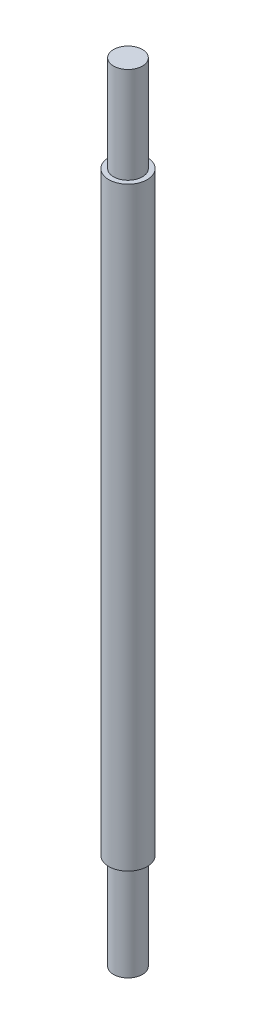
ISO-10303-21;
HEADER;
FILE_DESCRIPTION(('STEP AP214'),'2;1');
FILE_NAME('part.step','',(''),(''),'','','');
FILE_SCHEMA(('AUTOMOTIVE_DESIGN { 1 0 10303 214 1 1 1 1 }'));
ENDSEC;
DATA;
#1=APPLICATION_CONTEXT('core data for automotive mechanical design processes');
#2=APPLICATION_PROTOCOL_DEFINITION('international standard','automotive_design',2000,#1);
#3=PRODUCT_CONTEXT('',#1,'mechanical');
#4=PRODUCT('Part','Part','',(#3));
#5=PRODUCT_RELATED_PRODUCT_CATEGORY('part','',(#4));
#6=PRODUCT_DEFINITION_FORMATION('','',#4);
#7=PRODUCT_DEFINITION_CONTEXT('part definition',#1,'design');
#8=PRODUCT_DEFINITION('design','',#6,#7);
#9=PRODUCT_DEFINITION_SHAPE('','',#8);
#10=(LENGTH_UNIT() NAMED_UNIT(*) SI_UNIT(.MILLI.,.METRE.));
#11=(NAMED_UNIT(*) PLANE_ANGLE_UNIT() SI_UNIT($,.RADIAN.));
#12=(NAMED_UNIT(*) SI_UNIT($,.STERADIAN.) SOLID_ANGLE_UNIT());
#13=UNCERTAINTY_MEASURE_WITH_UNIT(LENGTH_MEASURE(1.E-05),#10,'distance_accuracy_value','');
#14=(GEOMETRIC_REPRESENTATION_CONTEXT(3) GLOBAL_UNCERTAINTY_ASSIGNED_CONTEXT((#13)) GLOBAL_UNIT_ASSIGNED_CONTEXT((#10,
#11,#12)) REPRESENTATION_CONTEXT('',''));
#15=CARTESIAN_POINT('',(0.,0.,0.));
#16=DIRECTION('',(0.,0.,1.));
#17=DIRECTION('',(1.,0.,0.));
#18=AXIS2_PLACEMENT_3D('',#15,#16,#17);
#19=CARTESIAN_POINT('',(0.,0.,0.));
#20=DIRECTION('',(0.,1.,0.));
#21=DIRECTION('',(0.,0.,1.));
#22=AXIS2_PLACEMENT_3D('',#19,#20,#21);
#23=PLANE('',#22);
#24=CARTESIAN_POINT('',(0.,0.,0.));
#25=DIRECTION('',(0.,1.,0.));
#26=DIRECTION('',(0.,0.,1.));
#27=AXIS2_PLACEMENT_3D('',#24,#25,#26);
#28=CIRCLE('',#27,2.);
#29=CARTESIAN_POINT('',(0.,0.,2.));
#30=VERTEX_POINT('',#29);
#31=EDGE_CURVE('E41',#30,#30,#28,.T.);
#32=ORIENTED_EDGE('',*,*,#31,.F.);
#33=EDGE_LOOP('',(#32));
#34=FACE_BOUND('',#33,.T.);
#35=CARTESIAN_POINT('',(0.,0.,0.));
#36=DIRECTION('',(0.,1.,0.));
#37=DIRECTION('',(0.,0.,1.));
#38=AXIS2_PLACEMENT_3D('',#35,#36,#37);
#39=CIRCLE('',#38,1.5);
#40=CARTESIAN_POINT('',(0.,0.,1.5));
#41=VERTEX_POINT('',#40);
#42=EDGE_CURVE('E10',#41,#41,#39,.F.);
#43=ORIENTED_EDGE('',*,*,#42,.F.);
#44=EDGE_LOOP('',(#43));
#45=FACE_BOUND('',#44,.T.);
#46=ADVANCED_FACE('F30',(#34,#45),#23,.F.);
#47=CARTESIAN_POINT('',(0.,62.,0.));
#48=DIRECTION('',(0.,1.,0.));
#49=DIRECTION('',(0.,0.,1.));
#50=AXIS2_PLACEMENT_3D('',#47,#48,#49);
#51=PLANE('',#50);
#52=CARTESIAN_POINT('',(0.,62.,0.));
#53=DIRECTION('',(0.,1.,0.));
#54=DIRECTION('',(0.,0.,1.));
#55=AXIS2_PLACEMENT_3D('',#52,#53,#54);
#56=CIRCLE('',#55,2.);
#57=CARTESIAN_POINT('',(0.,62.,2.));
#58=VERTEX_POINT('',#57);
#59=EDGE_CURVE('E37',#58,#58,#56,.T.);
#60=ORIENTED_EDGE('',*,*,#59,.T.);
#61=EDGE_LOOP('',(#60));
#62=FACE_BOUND('',#61,.T.);
#63=CARTESIAN_POINT('',(0.,62.,0.));
#64=DIRECTION('',(0.,1.,0.));
#65=DIRECTION('',(0.,0.,1.));
#66=AXIS2_PLACEMENT_3D('',#63,#64,#65);
#67=CIRCLE('',#66,1.5);
#68=CARTESIAN_POINT('',(0.,62.,1.5));
#69=VERTEX_POINT('',#68);
#70=EDGE_CURVE('E48',#69,#69,#67,.T.);
#71=ORIENTED_EDGE('',*,*,#70,.F.);
#72=EDGE_LOOP('',(#71));
#73=FACE_BOUND('',#72,.T.);
#74=ADVANCED_FACE('F72',(#62,#73),#51,.T.);
#75=CARTESIAN_POINT('',(0.,62.,0.));
#76=DIRECTION('',(0.,-1.,0.));
#77=DIRECTION('',(0.,0.,-1.));
#78=AXIS2_PLACEMENT_3D('',#75,#76,#77);
#79=CYLINDRICAL_SURFACE('',#78,2.);
#80=ORIENTED_EDGE('',*,*,#59,.F.);
#81=EDGE_LOOP('',(#80));
#82=FACE_BOUND('',#81,.T.);
#83=ORIENTED_EDGE('',*,*,#31,.T.);
#84=EDGE_LOOP('',(#83));
#85=FACE_BOUND('',#84,.T.);
#86=ADVANCED_FACE('F32',(#82,#85),#79,.T.);
#87=CARTESIAN_POINT('',(0.,72.,0.));
#88=DIRECTION('',(0.,-1.,0.));
#89=DIRECTION('',(0.,0.,-1.));
#90=AXIS2_PLACEMENT_3D('',#87,#88,#89);
#91=CYLINDRICAL_SURFACE('',#90,1.5);
#92=CARTESIAN_POINT('',(0.,72.,0.));
#93=DIRECTION('',(0.,1.,0.));
#94=DIRECTION('',(0.,0.,1.));
#95=AXIS2_PLACEMENT_3D('',#92,#93,#94);
#96=CIRCLE('',#95,1.5);
#97=CARTESIAN_POINT('',(0.,72.,1.5));
#98=VERTEX_POINT('',#97);
#99=EDGE_CURVE('E46',#98,#98,#96,.T.);
#100=ORIENTED_EDGE('',*,*,#99,.F.);
#101=EDGE_LOOP('',(#100));
#102=FACE_BOUND('',#101,.T.);
#103=ORIENTED_EDGE('',*,*,#70,.T.);
#104=EDGE_LOOP('',(#103));
#105=FACE_BOUND('',#104,.T.);
#106=ADVANCED_FACE('F68',(#102,#105),#91,.T.);
#107=CARTESIAN_POINT('',(0.,72.,0.));
#108=DIRECTION('',(0.,1.,0.));
#109=DIRECTION('',(0.,0.,1.));
#110=AXIS2_PLACEMENT_3D('',#107,#108,#109);
#111=PLANE('',#110);
#112=ORIENTED_EDGE('',*,*,#99,.T.);
#113=EDGE_LOOP('',(#112));
#114=FACE_BOUND('',#113,.T.);
#115=ADVANCED_FACE('F61',(#114),#111,.T.);
#116=CARTESIAN_POINT('',(0.,-10.,0.));
#117=DIRECTION('',(0.,1.,0.));
#118=DIRECTION('',(0.,0.,1.));
#119=AXIS2_PLACEMENT_3D('',#116,#117,#118);
#120=CYLINDRICAL_SURFACE('',#119,1.5);
#121=CARTESIAN_POINT('',(0.,-10.,0.));
#122=DIRECTION('',(0.,-1.,0.));
#123=DIRECTION('',(0.,0.,-1.));
#124=AXIS2_PLACEMENT_3D('',#121,#122,#123);
#125=CIRCLE('',#124,1.5);
#126=CARTESIAN_POINT('',(0.,-10.,-1.5));
#127=VERTEX_POINT('',#126);
#128=EDGE_CURVE('E51',#127,#127,#125,.T.);
#129=ORIENTED_EDGE('',*,*,#128,.F.);
#130=EDGE_LOOP('',(#129));
#131=FACE_BOUND('',#130,.T.);
#132=ORIENTED_EDGE('',*,*,#42,.T.);
#133=EDGE_LOOP('',(#132));
#134=FACE_BOUND('',#133,.T.);
#135=ADVANCED_FACE('F59',(#131,#134),#120,.T.);
#136=CARTESIAN_POINT('',(0.,-10.,0.));
#137=DIRECTION('',(0.,-1.,0.));
#138=DIRECTION('',(0.,0.,-1.));
#139=AXIS2_PLACEMENT_3D('',#136,#137,#138);
#140=PLANE('',#139);
#141=ORIENTED_EDGE('',*,*,#128,.T.);
#142=EDGE_LOOP('',(#141));
#143=FACE_BOUND('',#142,.T.);
#144=ADVANCED_FACE('F57',(#143),#140,.T.);
#145=CLOSED_SHELL('',(#46,#74,#86,#106,#115,#135,#144));
#146=MANIFOLD_SOLID_BREP('B2',#145);
#147=ADVANCED_BREP_SHAPE_REPRESENTATION('',(#18,#146),#14);
#148=SHAPE_DEFINITION_REPRESENTATION(#9,#147);
ENDSEC;
END-ISO-10303-21;
